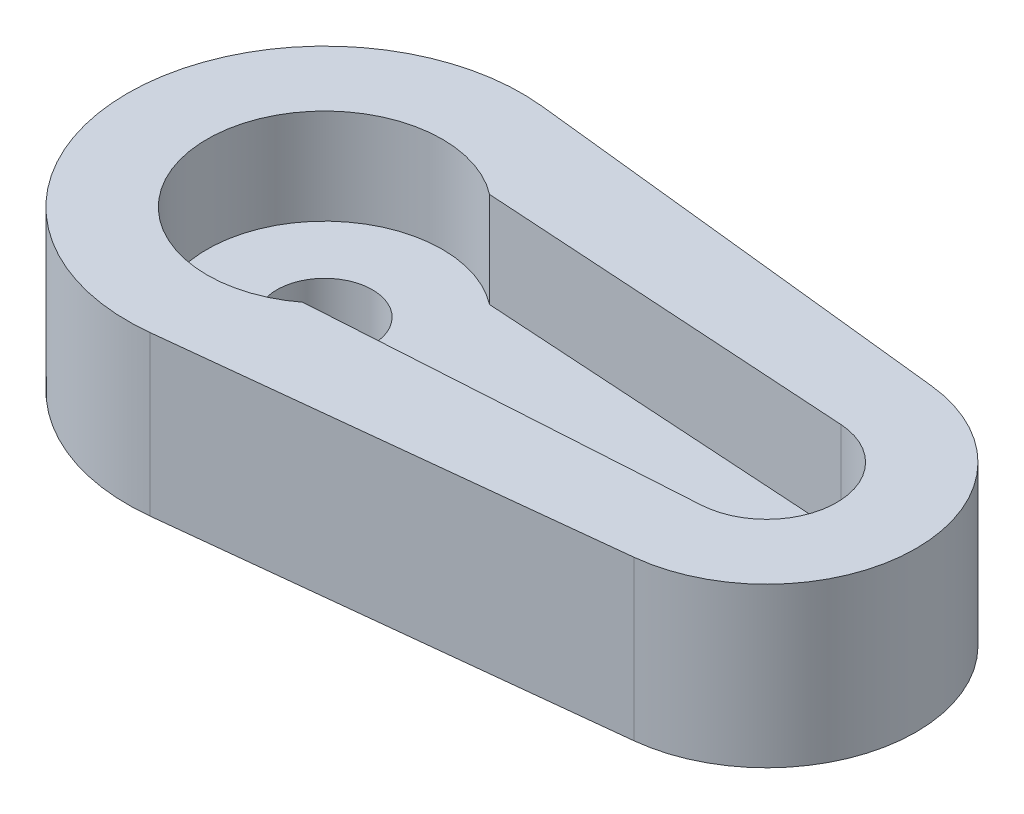
ISO-10303-21;
HEADER;
FILE_DESCRIPTION(('STEP AP214'),'2;1');
FILE_NAME('part.step','',(''),(''),'','','');
FILE_SCHEMA(('AUTOMOTIVE_DESIGN { 1 0 10303 214 1 1 1 1 }'));
ENDSEC;
DATA;
#1=APPLICATION_CONTEXT('core data for automotive mechanical design processes');
#2=APPLICATION_PROTOCOL_DEFINITION('international standard','automotive_design',2000,#1);
#3=PRODUCT_CONTEXT('',#1,'mechanical');
#4=PRODUCT('Part','Part','',(#3));
#5=PRODUCT_RELATED_PRODUCT_CATEGORY('part','',(#4));
#6=PRODUCT_DEFINITION_FORMATION('','',#4);
#7=PRODUCT_DEFINITION_CONTEXT('part definition',#1,'design');
#8=PRODUCT_DEFINITION('design','',#6,#7);
#9=PRODUCT_DEFINITION_SHAPE('','',#8);
#10=(LENGTH_UNIT() NAMED_UNIT(*) SI_UNIT(.MILLI.,.METRE.));
#11=(NAMED_UNIT(*) PLANE_ANGLE_UNIT() SI_UNIT($,.RADIAN.));
#12=(NAMED_UNIT(*) SI_UNIT($,.STERADIAN.) SOLID_ANGLE_UNIT());
#13=UNCERTAINTY_MEASURE_WITH_UNIT(LENGTH_MEASURE(1.E-05),#10,'distance_accuracy_value','');
#14=(GEOMETRIC_REPRESENTATION_CONTEXT(3) GLOBAL_UNCERTAINTY_ASSIGNED_CONTEXT((#13)) GLOBAL_UNIT_ASSIGNED_CONTEXT((#10,
#11,#12)) REPRESENTATION_CONTEXT('',''));
#15=CARTESIAN_POINT('',(0.,0.,0.));
#16=DIRECTION('',(0.,0.,1.));
#17=DIRECTION('',(1.,0.,0.));
#18=AXIS2_PLACEMENT_3D('',#15,#16,#17);
#19=CARTESIAN_POINT('',(0.,2.,0.));
#20=DIRECTION('',(0.,-1.,0.));
#21=DIRECTION('',(0.,0.,-1.));
#22=AXIS2_PLACEMENT_3D('',#19,#20,#21);
#23=CYLINDRICAL_SURFACE('',#22,1.5);
#24=CARTESIAN_POINT('',(0.,2.,0.));
#25=DIRECTION('',(0.,1.,0.));
#26=DIRECTION('',(0.,0.,1.));
#27=AXIS2_PLACEMENT_3D('',#24,#25,#26);
#28=CIRCLE('',#27,1.5);
#29=CARTESIAN_POINT('',(0.,2.,1.5));
#30=VERTEX_POINT('',#29);
#31=EDGE_CURVE('E159',#30,#30,#28,.T.);
#32=ORIENTED_EDGE('',*,*,#31,.T.);
#33=EDGE_LOOP('',(#32));
#34=FACE_BOUND('',#33,.T.);
#35=CARTESIAN_POINT('',(0.,0.,0.));
#36=DIRECTION('',(0.,1.,0.));
#37=DIRECTION('',(0.,0.,1.));
#38=AXIS2_PLACEMENT_3D('',#35,#36,#37);
#39=CIRCLE('',#38,1.5);
#40=CARTESIAN_POINT('',(0.,0.,1.5));
#41=VERTEX_POINT('',#40);
#42=EDGE_CURVE('E36',#41,#41,#39,.T.);
#43=ORIENTED_EDGE('',*,*,#42,.F.);
#44=EDGE_LOOP('',(#43));
#45=FACE_BOUND('',#44,.T.);
#46=ADVANCED_FACE('F33',(#34,#45),#23,.F.);
#47=CARTESIAN_POINT('',(0.,2.,0.));
#48=DIRECTION('',(0.,1.,0.));
#49=DIRECTION('',(0.,0.,1.));
#50=AXIS2_PLACEMENT_3D('',#47,#48,#49);
#51=PLANE('',#50);
#52=ORIENTED_EDGE('',*,*,#31,.F.);
#53=EDGE_LOOP('',(#52));
#54=FACE_BOUND('',#53,.T.);
#55=DIRECTION('',(0.998026967308897,0.,-0.0627867225152357));
#56=VECTOR('',#55,1.);
#57=CARTESIAN_POINT('',(0.192926987619971,2.,3.0666728354817));
#58=LINE('',#57,#56);
#59=CARTESIAN_POINT('',(2.25,2.,2.9372606285449));
#60=VERTEX_POINT('',#59);
#61=CARTESIAN_POINT('',(14.0381307895335,2.,2.19565932807957));
#62=VERTEX_POINT('',#61);
#63=EDGE_CURVE('E162',#60,#62,#58,.T.);
#64=ORIENTED_EDGE('',*,*,#63,.T.);
#65=CARTESIAN_POINT('',(13.9,2.,0.));
#66=DIRECTION('',(0.,1.,0.));
#67=DIRECTION('',(0.,0.,1.));
#68=AXIS2_PLACEMENT_3D('',#65,#66,#67);
#69=CIRCLE('',#68,2.2);
#70=CARTESIAN_POINT('',(14.0381307895335,2.,-2.19565932807957));
#71=VERTEX_POINT('',#70);
#72=EDGE_CURVE('E99',#62,#71,#69,.T.);
#73=ORIENTED_EDGE('',*,*,#72,.T.);
#74=DIRECTION('',(0.998026967308897,0.,0.0627867225152357));
#75=VECTOR('',#74,1.);
#76=CARTESIAN_POINT('',(0.192926987619971,2.,-3.0666728354817));
#77=LINE('',#76,#75);
#78=CARTESIAN_POINT('',(2.25,2.,-2.9372606285449));
#79=VERTEX_POINT('',#78);
#80=EDGE_CURVE('E41',#79,#71,#77,.T.);
#81=ORIENTED_EDGE('',*,*,#80,.F.);
#82=CARTESIAN_POINT('',(0.,2.,0.));
#83=DIRECTION('',(0.,1.,0.));
#84=DIRECTION('',(0.,0.,1.));
#85=AXIS2_PLACEMENT_3D('',#82,#83,#84);
#86=CIRCLE('',#85,3.7);
#87=EDGE_CURVE('E11',#79,#60,#86,.T.);
#88=ORIENTED_EDGE('',*,*,#87,.T.);
#89=EDGE_LOOP('',(#64,#73,#81,#88));
#90=FACE_BOUND('',#89,.T.);
#91=ADVANCED_FACE('F179',(#54,#90),#51,.T.);
#92=CARTESIAN_POINT('',(0.,0.,0.));
#93=DIRECTION('',(0.,1.,0.));
#94=DIRECTION('',(0.,0.,1.));
#95=AXIS2_PLACEMENT_3D('',#92,#93,#94);
#96=PLANE('',#95);
#97=ORIENTED_EDGE('',*,*,#42,.T.);
#98=EDGE_LOOP('',(#97));
#99=FACE_BOUND('',#98,.T.);
#100=DIRECTION('',(0.994160268784155,0.,-0.107913669064748));
#101=VECTOR('',#100,1.);
#102=CARTESIAN_POINT('',(0.669064748201439,0.,6.16379366646176));
#103=LINE('',#102,#101);
#104=CARTESIAN_POINT('',(0.669064748201439,0.,6.16379366646176));
#105=VERTEX_POINT('',#104);
#106=CARTESIAN_POINT('',(14.4071942446043,0.,4.67255326328553));
#107=VERTEX_POINT('',#106);
#108=EDGE_CURVE('E135',#105,#107,#103,.T.);
#109=ORIENTED_EDGE('',*,*,#108,.F.);
#110=CARTESIAN_POINT('',(0.,0.,0.));
#111=DIRECTION('',(0.,1.,0.));
#112=DIRECTION('',(0.,0.,1.));
#113=AXIS2_PLACEMENT_3D('',#110,#111,#112);
#114=CIRCLE('',#113,6.2);
#115=CARTESIAN_POINT('',(0.669064748201439,0.,-6.16379366646177));
#116=VERTEX_POINT('',#115);
#117=EDGE_CURVE('E115',#116,#105,#114,.T.);
#118=ORIENTED_EDGE('',*,*,#117,.F.);
#119=DIRECTION('',(0.994160268784155,0.,0.107913669064748));
#120=VECTOR('',#119,1.);
#121=CARTESIAN_POINT('',(0.66906474820144,0.,-6.16379366646177));
#122=LINE('',#121,#120);
#123=CARTESIAN_POINT('',(14.4071942446043,0.,-4.67255326328553));
#124=VERTEX_POINT('',#123);
#125=EDGE_CURVE('E141',#116,#124,#122,.T.);
#126=ORIENTED_EDGE('',*,*,#125,.T.);
#127=CARTESIAN_POINT('',(13.9,0.,0.));
#128=DIRECTION('',(0.,1.,0.));
#129=DIRECTION('',(0.,0.,1.));
#130=AXIS2_PLACEMENT_3D('',#127,#128,#129);
#131=CIRCLE('',#130,4.7);
#132=EDGE_CURVE('E138',#107,#124,#131,.T.);
#133=ORIENTED_EDGE('',*,*,#132,.F.);
#134=EDGE_LOOP('',(#109,#118,#126,#133));
#135=FACE_BOUND('',#134,.T.);
#136=ADVANCED_FACE('F184',(#99,#135),#96,.F.);
#137=CARTESIAN_POINT('',(0.669064748201439,5.,6.16379366646176));
#138=DIRECTION('',(-0.107913669064748,0.,-0.994160268784155));
#139=DIRECTION('',(-0.994160268784156,0.,0.107913669064748));
#140=AXIS2_PLACEMENT_3D('',#137,#138,#139);
#141=PLANE('',#140);
#142=ORIENTED_EDGE('',*,*,#108,.T.);
#143=DIRECTION('',(0.,-1.,0.));
#144=VECTOR('',#143,1.);
#145=CARTESIAN_POINT('',(14.4071942446043,5.,4.67255326328553));
#146=LINE('',#145,#144);
#147=CARTESIAN_POINT('',(14.4071942446043,5.,4.67255326328553));
#148=VERTEX_POINT('',#147);
#149=EDGE_CURVE('E151',#148,#107,#146,.T.);
#150=ORIENTED_EDGE('',*,*,#149,.F.);
#151=DIRECTION('',(0.994160268784155,0.,-0.107913669064748));
#152=VECTOR('',#151,1.);
#153=CARTESIAN_POINT('',(0.669064748201439,5.,6.16379366646176));
#154=LINE('',#153,#152);
#155=CARTESIAN_POINT('',(0.669064748201439,5.,6.16379366646176));
#156=VERTEX_POINT('',#155);
#157=EDGE_CURVE('E124',#156,#148,#154,.T.);
#158=ORIENTED_EDGE('',*,*,#157,.F.);
#159=DIRECTION('',(0.,-1.,0.));
#160=VECTOR('',#159,1.);
#161=CARTESIAN_POINT('',(0.669064748201439,5.,6.16379366646176));
#162=LINE('',#161,#160);
#163=EDGE_CURVE('E102',#156,#105,#162,.T.);
#164=ORIENTED_EDGE('',*,*,#163,.T.);
#165=EDGE_LOOP('',(#142,#150,#158,#164));
#166=FACE_BOUND('',#165,.T.);
#167=ADVANCED_FACE('F194',(#166),#141,.F.);
#168=CARTESIAN_POINT('',(13.9,5.,0.));
#169=DIRECTION('',(0.,-1.,0.));
#170=DIRECTION('',(0.,0.,-1.));
#171=AXIS2_PLACEMENT_3D('',#168,#169,#170);
#172=CYLINDRICAL_SURFACE('',#171,4.7);
#173=ORIENTED_EDGE('',*,*,#132,.T.);
#174=DIRECTION('',(0.,-1.,0.));
#175=VECTOR('',#174,1.);
#176=CARTESIAN_POINT('',(14.4071942446043,5.,-4.67255326328553));
#177=LINE('',#176,#175);
#178=CARTESIAN_POINT('',(14.4071942446043,5.,-4.67255326328553));
#179=VERTEX_POINT('',#178);
#180=EDGE_CURVE('E149',#179,#124,#177,.T.);
#181=ORIENTED_EDGE('',*,*,#180,.F.);
#182=CARTESIAN_POINT('',(13.9,5.,0.));
#183=DIRECTION('',(0.,1.,0.));
#184=DIRECTION('',(0.,0.,1.));
#185=AXIS2_PLACEMENT_3D('',#182,#183,#184);
#186=CIRCLE('',#185,4.7);
#187=EDGE_CURVE('E127',#148,#179,#186,.T.);
#188=ORIENTED_EDGE('',*,*,#187,.F.);
#189=ORIENTED_EDGE('',*,*,#149,.T.);
#190=EDGE_LOOP('',(#173,#181,#188,#189));
#191=FACE_BOUND('',#190,.T.);
#192=ADVANCED_FACE('F209',(#191),#172,.T.);
#193=CARTESIAN_POINT('',(0.66906474820144,5.,-6.16379366646177));
#194=DIRECTION('',(0.107913669064748,0.,-0.994160268784155));
#195=DIRECTION('',(-0.994160268784156,0.,-0.107913669064748));
#196=AXIS2_PLACEMENT_3D('',#193,#194,#195);
#197=PLANE('',#196);
#198=ORIENTED_EDGE('',*,*,#125,.F.);
#199=DIRECTION('',(0.,-1.,0.));
#200=VECTOR('',#199,1.);
#201=CARTESIAN_POINT('',(0.669064748201439,5.,-6.16379366646177));
#202=LINE('',#201,#200);
#203=CARTESIAN_POINT('',(0.669064748201439,5.,-6.16379366646177));
#204=VERTEX_POINT('',#203);
#205=EDGE_CURVE('E147',#204,#116,#202,.T.);
#206=ORIENTED_EDGE('',*,*,#205,.F.);
#207=DIRECTION('',(0.994160268784155,0.,0.107913669064748));
#208=VECTOR('',#207,1.);
#209=CARTESIAN_POINT('',(0.66906474820144,5.,-6.16379366646177));
#210=LINE('',#209,#208);
#211=EDGE_CURVE('E129',#204,#179,#210,.T.);
#212=ORIENTED_EDGE('',*,*,#211,.T.);
#213=ORIENTED_EDGE('',*,*,#180,.T.);
#214=EDGE_LOOP('',(#198,#206,#212,#213));
#215=FACE_BOUND('',#214,.T.);
#216=ADVANCED_FACE('F206',(#215),#197,.T.);
#217=CARTESIAN_POINT('',(13.9,5.,0.));
#218=DIRECTION('',(0.,-1.,0.));
#219=DIRECTION('',(0.,0.,-1.));
#220=AXIS2_PLACEMENT_3D('',#217,#218,#219);
#221=CYLINDRICAL_SURFACE('',#220,2.2);
#222=DIRECTION('',(0.,-1.,0.));
#223=VECTOR('',#222,1.);
#224=CARTESIAN_POINT('',(14.0381307895335,5.,-2.19565932807957));
#225=LINE('',#224,#223);
#226=CARTESIAN_POINT('',(14.0381307895335,5.,-2.19565932807957));
#227=VERTEX_POINT('',#226);
#228=EDGE_CURVE('E134',#227,#71,#225,.T.);
#229=ORIENTED_EDGE('',*,*,#228,.T.);
#230=ORIENTED_EDGE('',*,*,#72,.F.);
#231=DIRECTION('',(0.,-1.,0.));
#232=VECTOR('',#231,1.);
#233=CARTESIAN_POINT('',(14.0381307895335,5.,2.19565932807957));
#234=LINE('',#233,#232);
#235=CARTESIAN_POINT('',(14.0381307895335,5.,2.19565932807957));
#236=VERTEX_POINT('',#235);
#237=EDGE_CURVE('E94',#236,#62,#234,.T.);
#238=ORIENTED_EDGE('',*,*,#237,.F.);
#239=CARTESIAN_POINT('',(13.9,5.,0.));
#240=DIRECTION('',(0.,1.,0.));
#241=DIRECTION('',(0.,0.,1.));
#242=AXIS2_PLACEMENT_3D('',#239,#240,#241);
#243=CIRCLE('',#242,2.2);
#244=EDGE_CURVE('E98',#236,#227,#243,.T.);
#245=ORIENTED_EDGE('',*,*,#244,.T.);
#246=EDGE_LOOP('',(#229,#230,#238,#245));
#247=FACE_BOUND('',#246,.T.);
#248=ADVANCED_FACE('F97',(#247),#221,.F.);
#249=CARTESIAN_POINT('',(0.192926987619971,5.,3.0666728354817));
#250=DIRECTION('',(-0.0627867225152357,0.,-0.998026967308897));
#251=DIRECTION('',(-0.998026967308897,0.,0.0627867225152357));
#252=AXIS2_PLACEMENT_3D('',#249,#250,#251);
#253=PLANE('',#252);
#254=ORIENTED_EDGE('',*,*,#237,.T.);
#255=ORIENTED_EDGE('',*,*,#63,.F.);
#256=DIRECTION('',(0.,-1.,0.));
#257=VECTOR('',#256,1.);
#258=CARTESIAN_POINT('',(2.25,5.,2.9372606285449));
#259=LINE('',#258,#257);
#260=CARTESIAN_POINT('',(2.25,5.,2.9372606285449));
#261=VERTEX_POINT('',#260);
#262=EDGE_CURVE('E103',#261,#60,#259,.T.);
#263=ORIENTED_EDGE('',*,*,#262,.F.);
#264=DIRECTION('',(0.998026967308897,0.,-0.0627867225152357));
#265=VECTOR('',#264,1.);
#266=CARTESIAN_POINT('',(0.192926987619971,5.,3.0666728354817));
#267=LINE('',#266,#265);
#268=EDGE_CURVE('E110',#261,#236,#267,.T.);
#269=ORIENTED_EDGE('',*,*,#268,.T.);
#270=EDGE_LOOP('',(#254,#255,#263,#269));
#271=FACE_BOUND('',#270,.T.);
#272=ADVANCED_FACE('F117',(#271),#253,.T.);
#273=CARTESIAN_POINT('',(0.,5.,0.));
#274=DIRECTION('',(0.,-1.,0.));
#275=DIRECTION('',(0.,0.,-1.));
#276=AXIS2_PLACEMENT_3D('',#273,#274,#275);
#277=CYLINDRICAL_SURFACE('',#276,3.7);
#278=ORIENTED_EDGE('',*,*,#262,.T.);
#279=ORIENTED_EDGE('',*,*,#87,.F.);
#280=DIRECTION('',(0.,-1.,0.));
#281=VECTOR('',#280,1.);
#282=CARTESIAN_POINT('',(2.25,5.,-2.9372606285449));
#283=LINE('',#282,#281);
#284=CARTESIAN_POINT('',(2.25,5.,-2.9372606285449));
#285=VERTEX_POINT('',#284);
#286=EDGE_CURVE('E155',#285,#79,#283,.T.);
#287=ORIENTED_EDGE('',*,*,#286,.F.);
#288=CARTESIAN_POINT('',(0.,5.,0.));
#289=DIRECTION('',(0.,1.,0.));
#290=DIRECTION('',(0.,0.,1.));
#291=AXIS2_PLACEMENT_3D('',#288,#289,#290);
#292=CIRCLE('',#291,3.7);
#293=EDGE_CURVE('E119',#285,#261,#292,.T.);
#294=ORIENTED_EDGE('',*,*,#293,.T.);
#295=EDGE_LOOP('',(#278,#279,#287,#294));
#296=FACE_BOUND('',#295,.T.);
#297=ADVANCED_FACE('F168',(#296),#277,.F.);
#298=CARTESIAN_POINT('',(0.192926987619971,5.,-3.0666728354817));
#299=DIRECTION('',(0.0627867225152357,0.,-0.998026967308897));
#300=DIRECTION('',(-0.998026967308897,0.,-0.0627867225152357));
#301=AXIS2_PLACEMENT_3D('',#298,#299,#300);
#302=PLANE('',#301);
#303=ORIENTED_EDGE('',*,*,#80,.T.);
#304=ORIENTED_EDGE('',*,*,#228,.F.);
#305=DIRECTION('',(0.998026967308897,0.,0.0627867225152357));
#306=VECTOR('',#305,1.);
#307=CARTESIAN_POINT('',(0.192926987619971,5.,-3.0666728354817));
#308=LINE('',#307,#306);
#309=EDGE_CURVE('E113',#285,#227,#308,.T.);
#310=ORIENTED_EDGE('',*,*,#309,.F.);
#311=ORIENTED_EDGE('',*,*,#286,.T.);
#312=EDGE_LOOP('',(#303,#304,#310,#311));
#313=FACE_BOUND('',#312,.T.);
#314=ADVANCED_FACE('F166',(#313),#302,.F.);
#315=CARTESIAN_POINT('',(0.,5.,0.));
#316=DIRECTION('',(0.,-1.,0.));
#317=DIRECTION('',(0.,0.,-1.));
#318=AXIS2_PLACEMENT_3D('',#315,#316,#317);
#319=CYLINDRICAL_SURFACE('',#318,6.2);
#320=ORIENTED_EDGE('',*,*,#117,.T.);
#321=ORIENTED_EDGE('',*,*,#163,.F.);
#322=CARTESIAN_POINT('',(0.,5.,0.));
#323=DIRECTION('',(0.,1.,0.));
#324=DIRECTION('',(0.,0.,1.));
#325=AXIS2_PLACEMENT_3D('',#322,#323,#324);
#326=CIRCLE('',#325,6.2);
#327=EDGE_CURVE('E132',#204,#156,#326,.T.);
#328=ORIENTED_EDGE('',*,*,#327,.F.);
#329=ORIENTED_EDGE('',*,*,#205,.T.);
#330=EDGE_LOOP('',(#320,#321,#328,#329));
#331=FACE_BOUND('',#330,.T.);
#332=ADVANCED_FACE('F175',(#331),#319,.T.);
#333=CARTESIAN_POINT('',(0.,5.,0.));
#334=DIRECTION('',(0.,1.,0.));
#335=DIRECTION('',(0.,0.,1.));
#336=AXIS2_PLACEMENT_3D('',#333,#334,#335);
#337=PLANE('',#336);
#338=ORIENTED_EDGE('',*,*,#244,.F.);
#339=ORIENTED_EDGE('',*,*,#268,.F.);
#340=ORIENTED_EDGE('',*,*,#293,.F.);
#341=ORIENTED_EDGE('',*,*,#309,.T.);
#342=EDGE_LOOP('',(#338,#339,#340,#341));
#343=FACE_BOUND('',#342,.T.);
#344=ORIENTED_EDGE('',*,*,#157,.T.);
#345=ORIENTED_EDGE('',*,*,#187,.T.);
#346=ORIENTED_EDGE('',*,*,#211,.F.);
#347=ORIENTED_EDGE('',*,*,#327,.T.);
#348=EDGE_LOOP('',(#344,#345,#346,#347));
#349=FACE_BOUND('',#348,.T.);
#350=ADVANCED_FACE('F107',(#343,#349),#337,.T.);
#351=CLOSED_SHELL('',(#46,#91,#136,#167,#192,#216,#248,#272,#297,#314,#332,#350));
#352=MANIFOLD_SOLID_BREP('B2',#351);
#353=ADVANCED_BREP_SHAPE_REPRESENTATION('',(#18,#352),#14);
#354=SHAPE_DEFINITION_REPRESENTATION(#9,#353);
ENDSEC;
END-ISO-10303-21;
